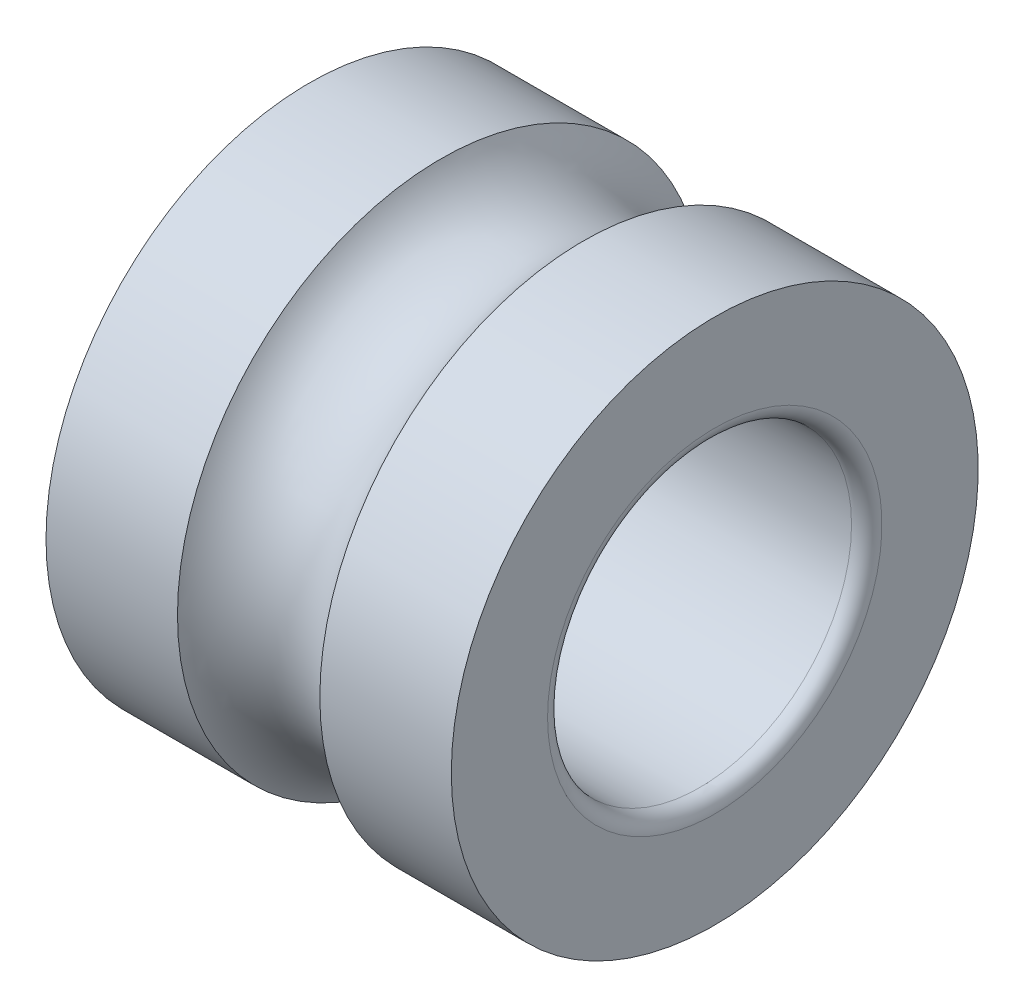
ISO-10303-21;
HEADER;
FILE_DESCRIPTION(('STEP AP214'),'2;1');
FILE_NAME('part.step','',(''),(''),'','','');
FILE_SCHEMA(('AUTOMOTIVE_DESIGN { 1 0 10303 214 1 1 1 1 }'));
ENDSEC;
DATA;
#1=APPLICATION_CONTEXT('core data for automotive mechanical design processes');
#2=APPLICATION_PROTOCOL_DEFINITION('international standard','automotive_design',2000,#1);
#3=PRODUCT_CONTEXT('',#1,'mechanical');
#4=PRODUCT('Part','Part','',(#3));
#5=PRODUCT_RELATED_PRODUCT_CATEGORY('part','',(#4));
#6=PRODUCT_DEFINITION_FORMATION('','',#4);
#7=PRODUCT_DEFINITION_CONTEXT('part definition',#1,'design');
#8=PRODUCT_DEFINITION('design','',#6,#7);
#9=PRODUCT_DEFINITION_SHAPE('','',#8);
#10=(LENGTH_UNIT() NAMED_UNIT(*) SI_UNIT(.MILLI.,.METRE.));
#11=(NAMED_UNIT(*) PLANE_ANGLE_UNIT() SI_UNIT($,.RADIAN.));
#12=(NAMED_UNIT(*) SI_UNIT($,.STERADIAN.) SOLID_ANGLE_UNIT());
#13=UNCERTAINTY_MEASURE_WITH_UNIT(LENGTH_MEASURE(1.E-05),#10,'distance_accuracy_value','');
#14=(GEOMETRIC_REPRESENTATION_CONTEXT(3) GLOBAL_UNCERTAINTY_ASSIGNED_CONTEXT((#13)) GLOBAL_UNIT_ASSIGNED_CONTEXT((#10,
#11,#12)) REPRESENTATION_CONTEXT('',''));
#15=CARTESIAN_POINT('',(0.,0.,0.));
#16=DIRECTION('',(0.,0.,1.));
#17=DIRECTION('',(1.,0.,0.));
#18=AXIS2_PLACEMENT_3D('',#15,#16,#17);
#19=CARTESIAN_POINT('',(2.,0.,0.));
#20=DIRECTION('',(-1.,0.,0.));
#21=DIRECTION('',(0.,0.,1.));
#22=AXIS2_PLACEMENT_3D('',#19,#20,#21);
#23=TOROIDAL_SURFACE('',#22,2.97,0.794);
#24=CARTESIAN_POINT('',(2.70252117405812,0.,0.));
#25=DIRECTION('',(-1.,0.,0.));
#26=DIRECTION('',(0.,0.,1.));
#27=AXIS2_PLACEMENT_3D('',#24,#25,#26);
#28=CIRCLE('',#27,2.6);
#29=CARTESIAN_POINT('',(2.70252117405812,0.,2.6));
#30=VERTEX_POINT('',#29);
#31=EDGE_CURVE('E55',#30,#30,#28,.T.);
#32=ORIENTED_EDGE('',*,*,#31,.T.);
#33=EDGE_LOOP('',(#32));
#34=FACE_BOUND('',#33,.T.);
#35=CARTESIAN_POINT('',(1.29747882594188,0.,0.));
#36=DIRECTION('',(-1.,0.,0.));
#37=DIRECTION('',(0.,0.,1.));
#38=AXIS2_PLACEMENT_3D('',#35,#36,#37);
#39=CIRCLE('',#38,2.6);
#40=CARTESIAN_POINT('',(1.29747882594188,0.,2.6));
#41=VERTEX_POINT('',#40);
#42=EDGE_CURVE('E10',#41,#41,#39,.T.);
#43=ORIENTED_EDGE('',*,*,#42,.F.);
#44=EDGE_LOOP('',(#43));
#45=FACE_BOUND('',#44,.T.);
#46=ADVANCED_FACE('F14',(#34,#45),#23,.F.);
#47=CARTESIAN_POINT('',(0.,0.,0.));
#48=DIRECTION('',(-1.,0.,0.));
#49=DIRECTION('',(0.,0.,1.));
#50=AXIS2_PLACEMENT_3D('',#47,#48,#49);
#51=CYLINDRICAL_SURFACE('',#50,2.6);
#52=ORIENTED_EDGE('',*,*,#42,.T.);
#53=EDGE_LOOP('',(#52));
#54=FACE_BOUND('',#53,.T.);
#55=CARTESIAN_POINT('',(0.,0.,0.));
#56=DIRECTION('',(-1.,0.,0.));
#57=DIRECTION('',(0.,0.,1.));
#58=AXIS2_PLACEMENT_3D('',#55,#56,#57);
#59=CIRCLE('',#58,2.6);
#60=CARTESIAN_POINT('',(0.,0.,2.6));
#61=VERTEX_POINT('',#60);
#62=EDGE_CURVE('E21',#61,#61,#59,.T.);
#63=ORIENTED_EDGE('',*,*,#62,.F.);
#64=EDGE_LOOP('',(#63));
#65=FACE_BOUND('',#64,.T.);
#66=ADVANCED_FACE('F76',(#54,#65),#51,.T.);
#67=CARTESIAN_POINT('',(0.,1.65,0.));
#68=DIRECTION('',(-1.,0.,0.));
#69=DIRECTION('',(0.,0.,1.));
#70=AXIS2_PLACEMENT_3D('',#67,#68,#69);
#71=PLANE('',#70);
#72=ORIENTED_EDGE('',*,*,#62,.T.);
#73=EDGE_LOOP('',(#72));
#74=FACE_BOUND('',#73,.T.);
#75=CARTESIAN_POINT('',(0.,0.,0.));
#76=DIRECTION('',(-1.,0.,0.));
#77=DIRECTION('',(0.,0.,1.));
#78=AXIS2_PLACEMENT_3D('',#75,#76,#77);
#79=CIRCLE('',#78,1.65);
#80=CARTESIAN_POINT('',(0.,0.,1.65));
#81=VERTEX_POINT('',#80);
#82=EDGE_CURVE('E30',#81,#81,#79,.T.);
#83=ORIENTED_EDGE('',*,*,#82,.F.);
#84=EDGE_LOOP('',(#83));
#85=FACE_BOUND('',#84,.T.);
#86=ADVANCED_FACE('F80',(#74,#85),#71,.T.);
#87=CARTESIAN_POINT('',(0.15,0.,0.));
#88=DIRECTION('',(-1.,0.,0.));
#89=DIRECTION('',(0.,0.,1.));
#90=AXIS2_PLACEMENT_3D('',#87,#88,#89);
#91=TOROIDAL_SURFACE('',#90,1.65,0.15);
#92=CARTESIAN_POINT('',(0.15,0.,0.));
#93=DIRECTION('',(-1.,0.,0.));
#94=DIRECTION('',(0.,0.,1.));
#95=AXIS2_PLACEMENT_3D('',#92,#93,#94);
#96=CIRCLE('',#95,1.5);
#97=CARTESIAN_POINT('',(0.15,0.,1.5));
#98=VERTEX_POINT('',#97);
#99=EDGE_CURVE('E37',#98,#98,#96,.T.);
#100=ORIENTED_EDGE('',*,*,#99,.F.);
#101=EDGE_LOOP('',(#100));
#102=FACE_BOUND('',#101,.T.);
#103=ORIENTED_EDGE('',*,*,#82,.T.);
#104=EDGE_LOOP('',(#103));
#105=FACE_BOUND('',#104,.T.);
#106=ADVANCED_FACE('F84',(#102,#105),#91,.T.);
#107=CARTESIAN_POINT('',(0.,0.,0.));
#108=DIRECTION('',(-1.,0.,0.));
#109=DIRECTION('',(0.,0.,1.));
#110=AXIS2_PLACEMENT_3D('',#107,#108,#109);
#111=CYLINDRICAL_SURFACE('',#110,1.5);
#112=CARTESIAN_POINT('',(3.85,0.,0.));
#113=DIRECTION('',(-1.,0.,0.));
#114=DIRECTION('',(0.,0.,1.));
#115=AXIS2_PLACEMENT_3D('',#112,#113,#114);
#116=CIRCLE('',#115,1.5);
#117=CARTESIAN_POINT('',(3.85,0.,1.5));
#118=VERTEX_POINT('',#117);
#119=EDGE_CURVE('E43',#118,#118,#116,.T.);
#120=ORIENTED_EDGE('',*,*,#119,.F.);
#121=EDGE_LOOP('',(#120));
#122=FACE_BOUND('',#121,.T.);
#123=ORIENTED_EDGE('',*,*,#99,.T.);
#124=EDGE_LOOP('',(#123));
#125=FACE_BOUND('',#124,.T.);
#126=ADVANCED_FACE('F90',(#122,#125),#111,.F.);
#127=CARTESIAN_POINT('',(3.85,0.,0.));
#128=DIRECTION('',(-1.,0.,0.));
#129=DIRECTION('',(0.,0.,1.));
#130=AXIS2_PLACEMENT_3D('',#127,#128,#129);
#131=TOROIDAL_SURFACE('',#130,1.65,0.15);
#132=CARTESIAN_POINT('',(4.,0.,0.));
#133=DIRECTION('',(-1.,0.,0.));
#134=DIRECTION('',(0.,0.,1.));
#135=AXIS2_PLACEMENT_3D('',#132,#133,#134);
#136=CIRCLE('',#135,1.65);
#137=CARTESIAN_POINT('',(4.,0.,1.65));
#138=VERTEX_POINT('',#137);
#139=EDGE_CURVE('E47',#138,#138,#136,.T.);
#140=ORIENTED_EDGE('',*,*,#139,.F.);
#141=EDGE_LOOP('',(#140));
#142=FACE_BOUND('',#141,.T.);
#143=ORIENTED_EDGE('',*,*,#119,.T.);
#144=EDGE_LOOP('',(#143));
#145=FACE_BOUND('',#144,.T.);
#146=ADVANCED_FACE('F72',(#142,#145),#131,.T.);
#147=CARTESIAN_POINT('',(4.,1.65,0.));
#148=DIRECTION('',(-1.,0.,0.));
#149=DIRECTION('',(0.,0.,1.));
#150=AXIS2_PLACEMENT_3D('',#147,#148,#149);
#151=PLANE('',#150);
#152=CARTESIAN_POINT('',(4.,0.,0.));
#153=DIRECTION('',(-1.,0.,0.));
#154=DIRECTION('',(0.,0.,1.));
#155=AXIS2_PLACEMENT_3D('',#152,#153,#154);
#156=CIRCLE('',#155,2.6);
#157=CARTESIAN_POINT('',(4.,0.,2.6));
#158=VERTEX_POINT('',#157);
#159=EDGE_CURVE('E51',#158,#158,#156,.T.);
#160=ORIENTED_EDGE('',*,*,#159,.F.);
#161=EDGE_LOOP('',(#160));
#162=FACE_BOUND('',#161,.T.);
#163=ORIENTED_EDGE('',*,*,#139,.T.);
#164=EDGE_LOOP('',(#163));
#165=FACE_BOUND('',#164,.T.);
#166=ADVANCED_FACE('F65',(#162,#165),#151,.F.);
#167=CARTESIAN_POINT('',(0.,0.,0.));
#168=DIRECTION('',(-1.,0.,0.));
#169=DIRECTION('',(0.,0.,1.));
#170=AXIS2_PLACEMENT_3D('',#167,#168,#169);
#171=CYLINDRICAL_SURFACE('',#170,2.6);
#172=ORIENTED_EDGE('',*,*,#159,.T.);
#173=EDGE_LOOP('',(#172));
#174=FACE_BOUND('',#173,.T.);
#175=ORIENTED_EDGE('',*,*,#31,.F.);
#176=EDGE_LOOP('',(#175));
#177=FACE_BOUND('',#176,.T.);
#178=ADVANCED_FACE('F63',(#174,#177),#171,.T.);
#179=CLOSED_SHELL('',(#46,#66,#86,#106,#126,#146,#166,#178));
#180=MANIFOLD_SOLID_BREP('B1',#179);
#181=ADVANCED_BREP_SHAPE_REPRESENTATION('',(#18,#180),#14);
#182=SHAPE_DEFINITION_REPRESENTATION(#9,#181);
ENDSEC;
END-ISO-10303-21;
